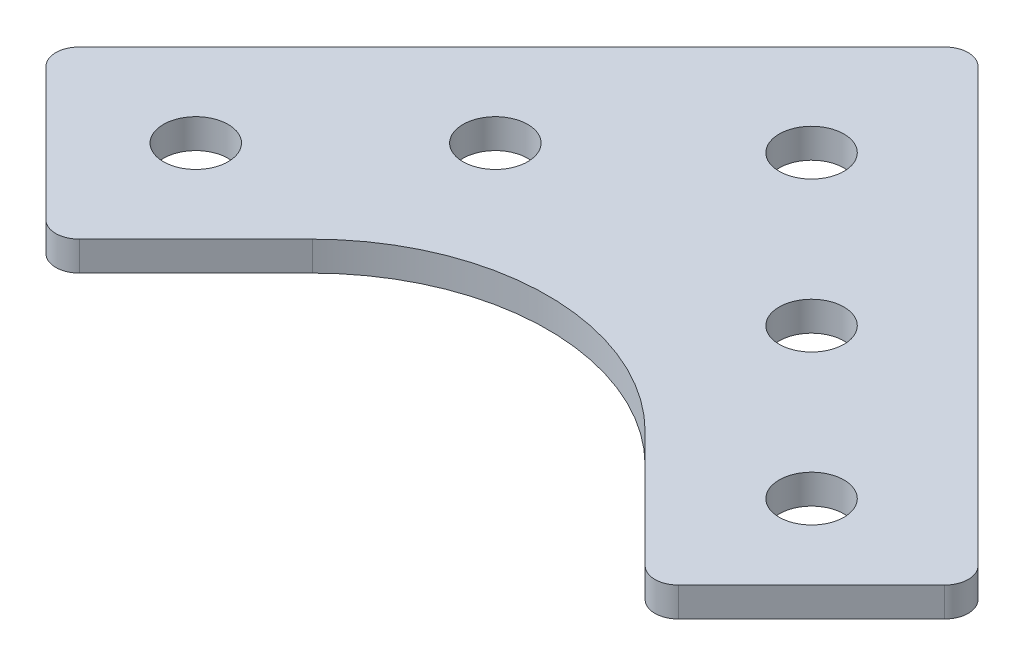
ISO-10303-21;
HEADER;
FILE_DESCRIPTION(('STEP AP214'),'2;1');
FILE_NAME('part.step','',(''),(''),'','','');
FILE_SCHEMA(('AUTOMOTIVE_DESIGN { 1 0 10303 214 1 1 1 1 }'));
ENDSEC;
DATA;
#1=APPLICATION_CONTEXT('core data for automotive mechanical design processes');
#2=APPLICATION_PROTOCOL_DEFINITION('international standard','automotive_design',2000,#1);
#3=PRODUCT_CONTEXT('',#1,'mechanical');
#4=PRODUCT('Part','Part','',(#3));
#5=PRODUCT_RELATED_PRODUCT_CATEGORY('part','',(#4));
#6=PRODUCT_DEFINITION_FORMATION('','',#4);
#7=PRODUCT_DEFINITION_CONTEXT('part definition',#1,'design');
#8=PRODUCT_DEFINITION('design','',#6,#7);
#9=PRODUCT_DEFINITION_SHAPE('','',#8);
#10=(LENGTH_UNIT() NAMED_UNIT(*) SI_UNIT(.MILLI.,.METRE.));
#11=(NAMED_UNIT(*) PLANE_ANGLE_UNIT() SI_UNIT($,.RADIAN.));
#12=(NAMED_UNIT(*) SI_UNIT($,.STERADIAN.) SOLID_ANGLE_UNIT());
#13=UNCERTAINTY_MEASURE_WITH_UNIT(LENGTH_MEASURE(1.E-05),#10,'distance_accuracy_value','');
#14=(GEOMETRIC_REPRESENTATION_CONTEXT(3) GLOBAL_UNCERTAINTY_ASSIGNED_CONTEXT((#13)) GLOBAL_UNIT_ASSIGNED_CONTEXT((#10,
#11,#12)) REPRESENTATION_CONTEXT('',''));
#15=CARTESIAN_POINT('',(0.,0.,0.));
#16=DIRECTION('',(0.,0.,1.));
#17=DIRECTION('',(1.,0.,0.));
#18=AXIS2_PLACEMENT_3D('',#15,#16,#17);
#19=CARTESIAN_POINT('',(-32.3289220358489,3.175,32.328922035849));
#20=DIRECTION('',(-0.707106781186547,0.,0.707106781186548));
#21=DIRECTION('',(0.707106781186548,0.,0.707106781186547));
#22=AXIS2_PLACEMENT_3D('',#19,#20,#21);
#23=PLANE('',#22);
#24=DIRECTION('',(-0.707106781186548,0.,-0.707106781186547));
#25=VECTOR('',#24,1.);
#26=CARTESIAN_POINT('',(-32.3289220358489,0.,32.328922035849));
#27=LINE('',#26,#25);
#28=CARTESIAN_POINT('',(-34.1249732600627,0.,30.5328708116352));
#29=VERTEX_POINT('',#28);
#30=CARTESIAN_POINT('',(-48.4933830537733,0.,16.1644610179246));
#31=VERTEX_POINT('',#30);
#32=EDGE_CURVE('E136',#29,#31,#27,.T.);
#33=ORIENTED_EDGE('',*,*,#32,.F.);
#34=DIRECTION('',(0.,-1.,0.));
#35=VECTOR('',#34,1.);
#36=CARTESIAN_POINT('',(-34.1249732600627,3.175,30.5328708116352));
#37=LINE('',#36,#35);
#38=CARTESIAN_POINT('',(-34.1249732600627,3.175,30.5328708116352));
#39=VERTEX_POINT('',#38);
#40=EDGE_CURVE('E220',#29,#39,#37,.F.);
#41=ORIENTED_EDGE('',*,*,#40,.T.);
#42=DIRECTION('',(-0.707106781186548,0.,-0.707106781186547));
#43=VECTOR('',#42,1.);
#44=CARTESIAN_POINT('',(-32.3289220358489,3.175,32.328922035849));
#45=LINE('',#44,#43);
#46=CARTESIAN_POINT('',(-48.4933830537733,3.175,16.1644610179246));
#47=VERTEX_POINT('',#46);
#48=EDGE_CURVE('E265',#39,#47,#45,.T.);
#49=ORIENTED_EDGE('',*,*,#48,.T.);
#50=DIRECTION('',(0.,-1.,0.));
#51=VECTOR('',#50,1.);
#52=CARTESIAN_POINT('',(-48.4933830537733,3.175,16.1644610179246));
#53=LINE('',#52,#51);
#54=EDGE_CURVE('E217',#47,#31,#53,.T.);
#55=ORIENTED_EDGE('',*,*,#54,.T.);
#56=EDGE_LOOP('',(#33,#41,#49,#55));
#57=FACE_BOUND('',#56,.T.);
#58=ADVANCED_FACE('F44',(#57),#23,.T.);
#59=CARTESIAN_POINT('',(0.,3.175,0.));
#60=DIRECTION('',(0.707106781186549,0.,0.707106781186546));
#61=DIRECTION('',(0.707106781186546,0.,-0.707106781186549));
#62=AXIS2_PLACEMENT_3D('',#59,#60,#61);
#63=PLANE('',#62);
#64=DIRECTION('',(-0.707106781186546,0.,0.707106781186549));
#65=VECTOR('',#64,1.);
#66=CARTESIAN_POINT('',(0.,0.,0.));
#67=LINE('',#66,#65);
#68=CARTESIAN_POINT('',(-17.9605122421384,0.,17.9605122421384));
#69=VERTEX_POINT('',#68);
#70=CARTESIAN_POINT('',(-30.5328708116351,0.,30.5328708116352));
#71=VERTEX_POINT('',#70);
#72=EDGE_CURVE('E243',#69,#71,#67,.T.);
#73=ORIENTED_EDGE('',*,*,#72,.F.);
#74=DIRECTION('',(0.,-1.,0.));
#75=VECTOR('',#74,1.);
#76=CARTESIAN_POINT('',(-17.9605122421384,3.175,17.9605122421384));
#77=LINE('',#76,#75);
#78=CARTESIAN_POINT('',(-17.9605122421384,3.175,17.9605122421384));
#79=VERTEX_POINT('',#78);
#80=EDGE_CURVE('E66',#69,#79,#77,.F.);
#81=ORIENTED_EDGE('',*,*,#80,.T.);
#82=DIRECTION('',(-0.707106781186546,0.,0.707106781186549));
#83=VECTOR('',#82,1.);
#84=CARTESIAN_POINT('',(0.,3.175,0.));
#85=LINE('',#84,#83);
#86=CARTESIAN_POINT('',(-30.5328708116351,3.175,30.5328708116352));
#87=VERTEX_POINT('',#86);
#88=EDGE_CURVE('E269',#79,#87,#85,.T.);
#89=ORIENTED_EDGE('',*,*,#88,.T.);
#90=DIRECTION('',(0.,-1.,0.));
#91=VECTOR('',#90,1.);
#92=CARTESIAN_POINT('',(-30.5328708116351,3.175,30.5328708116352));
#93=LINE('',#92,#91);
#94=EDGE_CURVE('E213',#87,#71,#93,.T.);
#95=ORIENTED_EDGE('',*,*,#94,.T.);
#96=EDGE_LOOP('',(#73,#81,#89,#95));
#97=FACE_BOUND('',#96,.T.);
#98=ADVANCED_FACE('F357',(#97),#63,.T.);
#99=CARTESIAN_POINT('',(32.3289220358488,3.175,32.3289220358491));
#100=DIRECTION('',(-0.70710678118655,0.,0.707106781186545));
#101=DIRECTION('',(0.707106781186545,0.,0.70710678118655));
#102=AXIS2_PLACEMENT_3D('',#99,#100,#101);
#103=PLANE('',#102);
#104=DIRECTION('',(-0.707106781186545,0.,-0.70710678118655));
#105=VECTOR('',#104,1.);
#106=CARTESIAN_POINT('',(32.3289220358488,3.175,32.3289220358491));
#107=LINE('',#106,#105);
#108=CARTESIAN_POINT('',(30.532870811635,3.175,30.5328708116352));
#109=VERTEX_POINT('',#108);
#110=CARTESIAN_POINT('',(17.9605122421383,3.175,17.9605122421385));
#111=VERTEX_POINT('',#110);
#112=EDGE_CURVE('E237',#109,#111,#107,.T.);
#113=ORIENTED_EDGE('',*,*,#112,.T.);
#114=DIRECTION('',(0.,-1.,0.));
#115=VECTOR('',#114,1.);
#116=CARTESIAN_POINT('',(17.9605122421383,0.,17.9605122421385));
#117=LINE('',#116,#115);
#118=CARTESIAN_POINT('',(17.9605122421383,0.,17.9605122421385));
#119=VERTEX_POINT('',#118);
#120=EDGE_CURVE('E223',#111,#119,#117,.T.);
#121=ORIENTED_EDGE('',*,*,#120,.T.);
#122=DIRECTION('',(-0.707106781186545,0.,-0.70710678118655));
#123=VECTOR('',#122,1.);
#124=CARTESIAN_POINT('',(32.3289220358488,0.,32.3289220358491));
#125=LINE('',#124,#123);
#126=CARTESIAN_POINT('',(30.532870811635,0.,30.5328708116352));
#127=VERTEX_POINT('',#126);
#128=EDGE_CURVE('E234',#127,#119,#125,.T.);
#129=ORIENTED_EDGE('',*,*,#128,.F.);
#130=DIRECTION('',(0.,-1.,0.));
#131=VECTOR('',#130,1.);
#132=CARTESIAN_POINT('',(30.532870811635,3.175,30.5328708116352));
#133=LINE('',#132,#131);
#134=EDGE_CURVE('E210',#127,#109,#133,.F.);
#135=ORIENTED_EDGE('',*,*,#134,.T.);
#136=EDGE_LOOP('',(#113,#121,#129,#135));
#137=FACE_BOUND('',#136,.T.);
#138=ADVANCED_FACE('F233',(#137),#103,.T.);
#139=CARTESIAN_POINT('',(32.3289220358488,3.175,32.3289220358491));
#140=DIRECTION('',(-0.707106781186545,0.,-0.70710678118655));
#141=DIRECTION('',(-0.70710678118655,0.,0.707106781186545));
#142=AXIS2_PLACEMENT_3D('',#139,#140,#141);
#143=PLANE('',#142);
#144=DIRECTION('',(0.70710678118655,0.,-0.707106781186545));
#145=VECTOR('',#144,1.);
#146=CARTESIAN_POINT('',(32.3289220358488,0.,32.3289220358491));
#147=LINE('',#146,#145);
#148=CARTESIAN_POINT('',(34.1249732600627,0.,30.5328708116352));
#149=VERTEX_POINT('',#148);
#150=CARTESIAN_POINT('',(48.4933830537734,0.,16.1644610179246));
#151=VERTEX_POINT('',#150);
#152=EDGE_CURVE('E242',#149,#151,#147,.T.);
#153=ORIENTED_EDGE('',*,*,#152,.T.);
#154=DIRECTION('',(0.,-1.,0.));
#155=VECTOR('',#154,1.);
#156=CARTESIAN_POINT('',(48.4933830537734,3.175,16.1644610179246));
#157=LINE('',#156,#155);
#158=CARTESIAN_POINT('',(48.4933830537734,3.175,16.1644610179246));
#159=VERTEX_POINT('',#158);
#160=EDGE_CURVE('E207',#151,#159,#157,.F.);
#161=ORIENTED_EDGE('',*,*,#160,.T.);
#162=DIRECTION('',(0.70710678118655,0.,-0.707106781186545));
#163=VECTOR('',#162,1.);
#164=CARTESIAN_POINT('',(32.3289220358488,3.175,32.3289220358491));
#165=LINE('',#164,#163);
#166=CARTESIAN_POINT('',(34.1249732600627,3.175,30.5328708116352));
#167=VERTEX_POINT('',#166);
#168=EDGE_CURVE('E166',#167,#159,#165,.T.);
#169=ORIENTED_EDGE('',*,*,#168,.F.);
#170=DIRECTION('',(0.,-1.,0.));
#171=VECTOR('',#170,1.);
#172=CARTESIAN_POINT('',(34.1249732600627,0.,30.5328708116352));
#173=LINE('',#172,#171);
#174=EDGE_CURVE('E203',#167,#149,#173,.T.);
#175=ORIENTED_EDGE('',*,*,#174,.T.);
#176=EDGE_LOOP('',(#153,#161,#169,#175));
#177=FACE_BOUND('',#176,.T.);
#178=ADVANCED_FACE('F394',(#177),#143,.F.);
#179=CARTESIAN_POINT('',(0.,3.175,-35.9210244842767));
#180=DIRECTION('',(0.707106781186549,0.,-0.707106781186546));
#181=DIRECTION('',(-0.707106781186546,0.,-0.707106781186549));
#182=AXIS2_PLACEMENT_3D('',#179,#180,#181);
#183=PLANE('',#182);
#184=DIRECTION('',(0.707106781186546,0.,0.707106781186549));
#185=VECTOR('',#184,1.);
#186=CARTESIAN_POINT('',(0.,0.,-35.9210244842767));
#187=LINE('',#186,#185);
#188=CARTESIAN_POINT('',(1.79605122421384,0.,-34.1249732600628));
#189=VERTEX_POINT('',#188);
#190=CARTESIAN_POINT('',(48.4933830537734,0.,12.572358569497));
#191=VERTEX_POINT('',#190);
#192=EDGE_CURVE('E154',#189,#191,#187,.T.);
#193=ORIENTED_EDGE('',*,*,#192,.F.);
#194=DIRECTION('',(0.,-1.,0.));
#195=VECTOR('',#194,1.);
#196=CARTESIAN_POINT('',(1.79605122421384,3.175,-34.1249732600628));
#197=LINE('',#196,#195);
#198=CARTESIAN_POINT('',(1.79605122421385,3.175,-34.1249732600628));
#199=VERTEX_POINT('',#198);
#200=EDGE_CURVE('E185',#189,#199,#197,.F.);
#201=ORIENTED_EDGE('',*,*,#200,.T.);
#202=DIRECTION('',(-0.707106781186545,0.,-0.70710678118655));
#203=VECTOR('',#202,1.);
#204=CARTESIAN_POINT('',(50.2894342779872,3.175,14.3684097937108));
#205=LINE('',#204,#203);
#206=CARTESIAN_POINT('',(48.4933830537734,3.175,12.572358569497));
#207=VERTEX_POINT('',#206);
#208=EDGE_CURVE('E160',#207,#199,#205,.T.);
#209=ORIENTED_EDGE('',*,*,#208,.F.);
#210=DIRECTION('',(0.,-1.,0.));
#211=VECTOR('',#210,1.);
#212=CARTESIAN_POINT('',(48.4933830537734,0.,12.5723585694969));
#213=LINE('',#212,#211);
#214=EDGE_CURVE('E181',#207,#191,#213,.T.);
#215=ORIENTED_EDGE('',*,*,#214,.T.);
#216=EDGE_LOOP('',(#193,#201,#209,#215));
#217=FACE_BOUND('',#216,.T.);
#218=ADVANCED_FACE('F256',(#217),#183,.T.);
#219=CARTESIAN_POINT('',(-17.9605122421382,3.175,-17.9605122421383));
#220=DIRECTION('',(-0.70710678118655,0.,-0.707106781186545));
#221=DIRECTION('',(-0.707106781186545,0.,0.70710678118655));
#222=AXIS2_PLACEMENT_3D('',#219,#220,#221);
#223=PLANE('',#222);
#224=DIRECTION('',(-0.707106781186547,0.,0.707106781186548));
#225=VECTOR('',#224,1.);
#226=CARTESIAN_POINT('',(-17.9605122421382,3.175,-17.9605122421383));
#227=LINE('',#226,#225);
#228=CARTESIAN_POINT('',(-1.79605122421378,3.175,-34.1249732600628));
#229=VERTEX_POINT('',#228);
#230=CARTESIAN_POINT('',(-48.4933830537734,3.175,12.5723585694969));
#231=VERTEX_POINT('',#230);
#232=EDGE_CURVE('E153',#229,#231,#227,.T.);
#233=ORIENTED_EDGE('',*,*,#232,.F.);
#234=DIRECTION('',(0.,-1.,0.));
#235=VECTOR('',#234,1.);
#236=CARTESIAN_POINT('',(-1.79605122421383,3.175,-34.1249732600628));
#237=LINE('',#236,#235);
#238=CARTESIAN_POINT('',(-1.79605122421383,0.,-34.1249732600628));
#239=VERTEX_POINT('',#238);
#240=EDGE_CURVE('E143',#229,#239,#237,.T.);
#241=ORIENTED_EDGE('',*,*,#240,.T.);
#242=DIRECTION('',(0.707106781186545,0.,-0.70710678118655));
#243=VECTOR('',#242,1.);
#244=CARTESIAN_POINT('',(-17.9605122421382,0.,-17.9605122421383));
#245=LINE('',#244,#243);
#246=CARTESIAN_POINT('',(-48.4933830537733,0.,12.572358569497));
#247=VERTEX_POINT('',#246);
#248=EDGE_CURVE('E134',#247,#239,#245,.T.);
#249=ORIENTED_EDGE('',*,*,#248,.F.);
#250=DIRECTION('',(0.,-1.,0.));
#251=VECTOR('',#250,1.);
#252=CARTESIAN_POINT('',(-48.4933830537733,3.175,12.572358569497));
#253=LINE('',#252,#251);
#254=EDGE_CURVE('E149',#247,#231,#253,.F.);
#255=ORIENTED_EDGE('',*,*,#254,.T.);
#256=EDGE_LOOP('',(#233,#241,#249,#255));
#257=FACE_BOUND('',#256,.T.);
#258=ADVANCED_FACE('F148',(#257),#223,.T.);
#259=CARTESIAN_POINT('',(0.,3.175,0.));
#260=DIRECTION('',(0.,-1.,0.));
#261=DIRECTION('',(0.,0.,-1.));
#262=AXIS2_PLACEMENT_3D('',#259,#260,#261);
#263=PLANE('',#262);
#264=CARTESIAN_POINT('',(17.0624866300314,3.175,-0.898025612106834));
#265=DIRECTION('',(0.,1.,0.));
#266=DIRECTION('',(0.,0.,1.));
#267=AXIS2_PLACEMENT_3D('',#264,#265,#266);
#268=CIRCLE('',#267,3.49250000000001);
#269=CARTESIAN_POINT('',(17.0624866300314,3.175,2.59447438789317));
#270=VERTEX_POINT('',#269);
#271=EDGE_CURVE('E315',#270,#270,#268,.T.);
#272=ORIENTED_EDGE('',*,*,#271,.F.);
#273=EDGE_LOOP('',(#272));
#274=FACE_BOUND('',#273,.T.);
#275=CARTESIAN_POINT('',(0.898025612106959,3.175,-17.0624866300314));
#276=DIRECTION('',(0.,1.,0.));
#277=DIRECTION('',(0.,0.,1.));
#278=AXIS2_PLACEMENT_3D('',#275,#276,#277);
#279=CIRCLE('',#278,3.49250000000001);
#280=CARTESIAN_POINT('',(0.898025612106959,3.175,-13.5699866300313));
#281=VERTEX_POINT('',#280);
#282=EDGE_CURVE('E307',#281,#281,#279,.T.);
#283=ORIENTED_EDGE('',*,*,#282,.F.);
#284=EDGE_LOOP('',(#283));
#285=FACE_BOUND('',#284,.T.);
#286=CARTESIAN_POINT('',(33.2269476479558,3.175,15.2664354058177));
#287=DIRECTION('',(0.,1.,0.));
#288=DIRECTION('',(0.,0.,1.));
#289=AXIS2_PLACEMENT_3D('',#286,#287,#288);
#290=CIRCLE('',#289,3.49250000000001);
#291=CARTESIAN_POINT('',(33.2269476479558,3.175,18.7589354058177));
#292=VERTEX_POINT('',#291);
#293=EDGE_CURVE('E299',#292,#292,#290,.T.);
#294=ORIENTED_EDGE('',*,*,#293,.F.);
#295=EDGE_LOOP('',(#294));
#296=FACE_BOUND('',#295,.T.);
#297=CARTESIAN_POINT('',(-17.0624866300314,3.175,-0.898025612106886));
#298=DIRECTION('',(0.,1.,0.));
#299=DIRECTION('',(0.,0.,1.));
#300=AXIS2_PLACEMENT_3D('',#297,#298,#299);
#301=CIRCLE('',#300,3.49250000000001);
#302=CARTESIAN_POINT('',(-17.0624866300314,3.175,2.59447438789312));
#303=VERTEX_POINT('',#302);
#304=EDGE_CURVE('E291',#303,#303,#301,.T.);
#305=ORIENTED_EDGE('',*,*,#304,.F.);
#306=EDGE_LOOP('',(#305));
#307=FACE_BOUND('',#306,.T.);
#308=CARTESIAN_POINT('',(-33.2269476479558,3.175,15.2664354058176));
#309=DIRECTION('',(0.,1.,0.));
#310=DIRECTION('',(0.,0.,1.));
#311=AXIS2_PLACEMENT_3D('',#308,#309,#310);
#312=CIRCLE('',#311,3.49250000000001);
#313=CARTESIAN_POINT('',(-33.2269476479558,3.175,18.7589354058176));
#314=VERTEX_POINT('',#313);
#315=EDGE_CURVE('E272',#314,#314,#312,.T.);
#316=ORIENTED_EDGE('',*,*,#315,.F.);
#317=EDGE_LOOP('',(#316));
#318=FACE_BOUND('',#317,.T.);
#319=ORIENTED_EDGE('',*,*,#208,.T.);
#320=CARTESIAN_POINT('',(0.,3.175,-32.328922035849));
#321=DIRECTION('',(0.,-1.,0.));
#322=DIRECTION('',(0.,0.,-1.));
#323=AXIS2_PLACEMENT_3D('',#320,#321,#322);
#324=CIRCLE('',#323,2.54);
#325=EDGE_CURVE('E200',#199,#229,#324,.F.);
#326=ORIENTED_EDGE('',*,*,#325,.T.);
#327=ORIENTED_EDGE('',*,*,#232,.T.);
#328=CARTESIAN_POINT('',(-46.6973318295594,3.175,14.3684097937108));
#329=DIRECTION('',(0.,-1.,0.));
#330=DIRECTION('',(0.,0.,-1.));
#331=AXIS2_PLACEMENT_3D('',#328,#329,#330);
#332=CIRCLE('',#331,2.54);
#333=EDGE_CURVE('E158',#231,#47,#332,.F.);
#334=ORIENTED_EDGE('',*,*,#333,.T.);
#335=ORIENTED_EDGE('',*,*,#48,.F.);
#336=CARTESIAN_POINT('',(-32.3289220358489,3.175,28.7368195874213));
#337=DIRECTION('',(0.,-1.,0.));
#338=DIRECTION('',(0.,0.,-1.));
#339=AXIS2_PLACEMENT_3D('',#336,#337,#338);
#340=CIRCLE('',#339,2.54);
#341=EDGE_CURVE('E190',#39,#87,#340,.F.);
#342=ORIENTED_EDGE('',*,*,#341,.T.);
#343=ORIENTED_EDGE('',*,*,#88,.F.);
#344=CARTESIAN_POINT('',(0.,3.175,35.9210244842767));
#345=DIRECTION('',(0.,-1.,0.));
#346=DIRECTION('',(0.,0.,-1.));
#347=AXIS2_PLACEMENT_3D('',#344,#345,#346);
#348=CIRCLE('',#347,25.4);
#349=EDGE_CURVE('E11',#79,#111,#348,.T.);
#350=ORIENTED_EDGE('',*,*,#349,.T.);
#351=ORIENTED_EDGE('',*,*,#112,.F.);
#352=CARTESIAN_POINT('',(32.3289220358488,3.175,28.7368195874214));
#353=DIRECTION('',(0.,-1.,0.));
#354=DIRECTION('',(0.,0.,-1.));
#355=AXIS2_PLACEMENT_3D('',#352,#353,#354);
#356=CIRCLE('',#355,2.54);
#357=EDGE_CURVE('E194',#109,#167,#356,.F.);
#358=ORIENTED_EDGE('',*,*,#357,.T.);
#359=ORIENTED_EDGE('',*,*,#168,.T.);
#360=CARTESIAN_POINT('',(46.6973318295596,3.175,14.3684097937108));
#361=DIRECTION('',(0.,-1.,0.));
#362=DIRECTION('',(0.,0.,-1.));
#363=AXIS2_PLACEMENT_3D('',#360,#361,#362);
#364=CIRCLE('',#363,2.54);
#365=EDGE_CURVE('E197',#159,#207,#364,.F.);
#366=ORIENTED_EDGE('',*,*,#365,.T.);
#367=EDGE_LOOP('',(#319,#326,#327,#334,#335,#342,#343,#350,#351,#358,#359,#366));
#368=FACE_BOUND('',#367,.T.);
#369=ADVANCED_FACE('F263',(#274,#285,#296,#307,#318,#368),#263,.F.);
#370=CARTESIAN_POINT('',(0.,0.,0.));
#371=DIRECTION('',(0.,-1.,0.));
#372=DIRECTION('',(0.,0.,-1.));
#373=AXIS2_PLACEMENT_3D('',#370,#371,#372);
#374=PLANE('',#373);
#375=CARTESIAN_POINT('',(17.0624866300314,0.,-0.898025612106834));
#376=DIRECTION('',(0.,1.,0.));
#377=DIRECTION('',(0.,0.,1.));
#378=AXIS2_PLACEMENT_3D('',#375,#376,#377);
#379=CIRCLE('',#378,3.49250000000001);
#380=CARTESIAN_POINT('',(17.0624866300314,0.,2.59447438789317));
#381=VERTEX_POINT('',#380);
#382=EDGE_CURVE('E303',#381,#381,#379,.T.);
#383=ORIENTED_EDGE('',*,*,#382,.T.);
#384=EDGE_LOOP('',(#383));
#385=FACE_BOUND('',#384,.T.);
#386=CARTESIAN_POINT('',(0.898025612106959,0.,-17.0624866300314));
#387=DIRECTION('',(0.,1.,0.));
#388=DIRECTION('',(0.,0.,1.));
#389=AXIS2_PLACEMENT_3D('',#386,#387,#388);
#390=CIRCLE('',#389,3.49250000000001);
#391=CARTESIAN_POINT('',(0.898025612106959,0.,-13.5699866300313));
#392=VERTEX_POINT('',#391);
#393=EDGE_CURVE('E311',#392,#392,#390,.T.);
#394=ORIENTED_EDGE('',*,*,#393,.T.);
#395=EDGE_LOOP('',(#394));
#396=FACE_BOUND('',#395,.T.);
#397=CARTESIAN_POINT('',(33.2269476479558,0.,15.2664354058177));
#398=DIRECTION('',(0.,1.,0.));
#399=DIRECTION('',(0.,0.,1.));
#400=AXIS2_PLACEMENT_3D('',#397,#398,#399);
#401=CIRCLE('',#400,3.49250000000001);
#402=CARTESIAN_POINT('',(33.2269476479558,0.,18.7589354058177));
#403=VERTEX_POINT('',#402);
#404=EDGE_CURVE('E295',#403,#403,#401,.T.);
#405=ORIENTED_EDGE('',*,*,#404,.T.);
#406=EDGE_LOOP('',(#405));
#407=FACE_BOUND('',#406,.T.);
#408=CARTESIAN_POINT('',(-17.0624866300314,0.,-0.898025612106886));
#409=DIRECTION('',(0.,1.,0.));
#410=DIRECTION('',(0.,0.,1.));
#411=AXIS2_PLACEMENT_3D('',#408,#409,#410);
#412=CIRCLE('',#411,3.49250000000001);
#413=CARTESIAN_POINT('',(-17.0624866300314,0.,2.59447438789312));
#414=VERTEX_POINT('',#413);
#415=EDGE_CURVE('E289',#414,#414,#412,.T.);
#416=ORIENTED_EDGE('',*,*,#415,.T.);
#417=EDGE_LOOP('',(#416));
#418=FACE_BOUND('',#417,.T.);
#419=CARTESIAN_POINT('',(-33.2269476479558,0.,15.2664354058176));
#420=DIRECTION('',(0.,1.,0.));
#421=DIRECTION('',(0.,0.,1.));
#422=AXIS2_PLACEMENT_3D('',#419,#420,#421);
#423=CIRCLE('',#422,3.49250000000001);
#424=CARTESIAN_POINT('',(-33.2269476479558,0.,18.7589354058176));
#425=VERTEX_POINT('',#424);
#426=EDGE_CURVE('E282',#425,#425,#423,.T.);
#427=ORIENTED_EDGE('',*,*,#426,.T.);
#428=EDGE_LOOP('',(#427));
#429=FACE_BOUND('',#428,.T.);
#430=ORIENTED_EDGE('',*,*,#248,.T.);
#431=CARTESIAN_POINT('',(0.,0.,-32.328922035849));
#432=DIRECTION('',(0.,-1.,0.));
#433=DIRECTION('',(0.,0.,-1.));
#434=AXIS2_PLACEMENT_3D('',#431,#432,#433);
#435=CIRCLE('',#434,2.54);
#436=EDGE_CURVE('E178',#239,#189,#435,.T.);
#437=ORIENTED_EDGE('',*,*,#436,.T.);
#438=ORIENTED_EDGE('',*,*,#192,.T.);
#439=CARTESIAN_POINT('',(46.6973318295596,0.,14.3684097937108));
#440=DIRECTION('',(0.,-1.,0.));
#441=DIRECTION('',(0.,0.,-1.));
#442=AXIS2_PLACEMENT_3D('',#439,#440,#441);
#443=CIRCLE('',#442,2.54);
#444=EDGE_CURVE('E175',#191,#151,#443,.T.);
#445=ORIENTED_EDGE('',*,*,#444,.T.);
#446=ORIENTED_EDGE('',*,*,#152,.F.);
#447=CARTESIAN_POINT('',(32.3289220358488,0.,28.7368195874214));
#448=DIRECTION('',(0.,-1.,0.));
#449=DIRECTION('',(0.,0.,-1.));
#450=AXIS2_PLACEMENT_3D('',#447,#448,#449);
#451=CIRCLE('',#450,2.54);
#452=EDGE_CURVE('E172',#149,#127,#451,.T.);
#453=ORIENTED_EDGE('',*,*,#452,.T.);
#454=ORIENTED_EDGE('',*,*,#128,.T.);
#455=CARTESIAN_POINT('',(0.,0.,35.9210244842767));
#456=DIRECTION('',(0.,-1.,0.));
#457=DIRECTION('',(0.,0.,-1.));
#458=AXIS2_PLACEMENT_3D('',#455,#456,#457);
#459=CIRCLE('',#458,25.4);
#460=EDGE_CURVE('E53',#119,#69,#459,.F.);
#461=ORIENTED_EDGE('',*,*,#460,.T.);
#462=ORIENTED_EDGE('',*,*,#72,.T.);
#463=CARTESIAN_POINT('',(-32.3289220358489,0.,28.7368195874213));
#464=DIRECTION('',(0.,-1.,0.));
#465=DIRECTION('',(0.,0.,-1.));
#466=AXIS2_PLACEMENT_3D('',#463,#464,#465);
#467=CIRCLE('',#466,2.54);
#468=EDGE_CURVE('E142',#71,#29,#467,.T.);
#469=ORIENTED_EDGE('',*,*,#468,.T.);
#470=ORIENTED_EDGE('',*,*,#32,.T.);
#471=CARTESIAN_POINT('',(-46.6973318295594,0.,14.3684097937108));
#472=DIRECTION('',(0.,-1.,0.));
#473=DIRECTION('',(0.,0.,-1.));
#474=AXIS2_PLACEMENT_3D('',#471,#472,#473);
#475=CIRCLE('',#474,2.54);
#476=EDGE_CURVE('E131',#31,#247,#475,.T.);
#477=ORIENTED_EDGE('',*,*,#476,.T.);
#478=EDGE_LOOP('',(#430,#437,#438,#445,#446,#453,#454,#461,#462,#469,#470,#477));
#479=FACE_BOUND('',#478,.T.);
#480=ADVANCED_FACE('F133',(#385,#396,#407,#418,#429,#479),#374,.T.);
#481=CARTESIAN_POINT('',(-33.2269476479558,0.,15.2664354058176));
#482=DIRECTION('',(0.,1.,0.));
#483=DIRECTION('',(0.,0.,1.));
#484=AXIS2_PLACEMENT_3D('',#481,#482,#483);
#485=CYLINDRICAL_SURFACE('',#484,3.49250000000001);
#486=ORIENTED_EDGE('',*,*,#426,.F.);
#487=EDGE_LOOP('',(#486));
#488=FACE_BOUND('',#487,.T.);
#489=ORIENTED_EDGE('',*,*,#315,.T.);
#490=EDGE_LOOP('',(#489));
#491=FACE_BOUND('',#490,.T.);
#492=ADVANCED_FACE('F343',(#488,#491),#485,.F.);
#493=CARTESIAN_POINT('',(-17.0624866300314,0.,-0.898025612106886));
#494=DIRECTION('',(0.,1.,0.));
#495=DIRECTION('',(0.,0.,1.));
#496=AXIS2_PLACEMENT_3D('',#493,#494,#495);
#497=CYLINDRICAL_SURFACE('',#496,3.49250000000001);
#498=ORIENTED_EDGE('',*,*,#415,.F.);
#499=EDGE_LOOP('',(#498));
#500=FACE_BOUND('',#499,.T.);
#501=ORIENTED_EDGE('',*,*,#304,.T.);
#502=EDGE_LOOP('',(#501));
#503=FACE_BOUND('',#502,.T.);
#504=ADVANCED_FACE('F345',(#500,#503),#497,.F.);
#505=CARTESIAN_POINT('',(33.2269476479558,0.,15.2664354058177));
#506=DIRECTION('',(0.,1.,0.));
#507=DIRECTION('',(0.,0.,1.));
#508=AXIS2_PLACEMENT_3D('',#505,#506,#507);
#509=CYLINDRICAL_SURFACE('',#508,3.49250000000001);
#510=ORIENTED_EDGE('',*,*,#404,.F.);
#511=EDGE_LOOP('',(#510));
#512=FACE_BOUND('',#511,.T.);
#513=ORIENTED_EDGE('',*,*,#293,.T.);
#514=EDGE_LOOP('',(#513));
#515=FACE_BOUND('',#514,.T.);
#516=ADVANCED_FACE('F352',(#512,#515),#509,.F.);
#517=CARTESIAN_POINT('',(0.898025612106959,0.,-17.0624866300314));
#518=DIRECTION('',(0.,1.,0.));
#519=DIRECTION('',(0.,0.,1.));
#520=AXIS2_PLACEMENT_3D('',#517,#518,#519);
#521=CYLINDRICAL_SURFACE('',#520,3.49250000000001);
#522=ORIENTED_EDGE('',*,*,#393,.F.);
#523=EDGE_LOOP('',(#522));
#524=FACE_BOUND('',#523,.T.);
#525=ORIENTED_EDGE('',*,*,#282,.T.);
#526=EDGE_LOOP('',(#525));
#527=FACE_BOUND('',#526,.T.);
#528=ADVANCED_FACE('F328',(#524,#527),#521,.F.);
#529=CARTESIAN_POINT('',(17.0624866300314,0.,-0.898025612106834));
#530=DIRECTION('',(0.,1.,0.));
#531=DIRECTION('',(0.,0.,1.));
#532=AXIS2_PLACEMENT_3D('',#529,#530,#531);
#533=CYLINDRICAL_SURFACE('',#532,3.49250000000001);
#534=ORIENTED_EDGE('',*,*,#382,.F.);
#535=EDGE_LOOP('',(#534));
#536=FACE_BOUND('',#535,.T.);
#537=ORIENTED_EDGE('',*,*,#271,.T.);
#538=EDGE_LOOP('',(#537));
#539=FACE_BOUND('',#538,.T.);
#540=ADVANCED_FACE('F325',(#536,#539),#533,.F.);
#541=CARTESIAN_POINT('',(0.,3.175,-32.328922035849));
#542=DIRECTION('',(0.,-1.,0.));
#543=DIRECTION('',(0.,0.,-1.));
#544=AXIS2_PLACEMENT_3D('',#541,#542,#543);
#545=CYLINDRICAL_SURFACE('',#544,2.54);
#546=ORIENTED_EDGE('',*,*,#325,.F.);
#547=ORIENTED_EDGE('',*,*,#200,.F.);
#548=ORIENTED_EDGE('',*,*,#436,.F.);
#549=ORIENTED_EDGE('',*,*,#240,.F.);
#550=EDGE_LOOP('',(#546,#547,#548,#549));
#551=FACE_BOUND('',#550,.T.);
#552=ADVANCED_FACE('F261',(#551),#545,.T.);
#553=CARTESIAN_POINT('',(46.6973318295596,3.175,14.3684097937108));
#554=DIRECTION('',(0.,1.,0.));
#555=DIRECTION('',(0.,0.,1.));
#556=AXIS2_PLACEMENT_3D('',#553,#554,#555);
#557=CYLINDRICAL_SURFACE('',#556,2.54);
#558=ORIENTED_EDGE('',*,*,#365,.F.);
#559=ORIENTED_EDGE('',*,*,#160,.F.);
#560=ORIENTED_EDGE('',*,*,#444,.F.);
#561=ORIENTED_EDGE('',*,*,#214,.F.);
#562=EDGE_LOOP('',(#558,#559,#560,#561));
#563=FACE_BOUND('',#562,.T.);
#564=ADVANCED_FACE('F368',(#563),#557,.T.);
#565=CARTESIAN_POINT('',(32.3289220358488,3.175,28.7368195874214));
#566=DIRECTION('',(0.,1.,0.));
#567=DIRECTION('',(0.,0.,1.));
#568=AXIS2_PLACEMENT_3D('',#565,#566,#567);
#569=CYLINDRICAL_SURFACE('',#568,2.54);
#570=ORIENTED_EDGE('',*,*,#357,.F.);
#571=ORIENTED_EDGE('',*,*,#134,.F.);
#572=ORIENTED_EDGE('',*,*,#452,.F.);
#573=ORIENTED_EDGE('',*,*,#174,.F.);
#574=EDGE_LOOP('',(#570,#571,#572,#573));
#575=FACE_BOUND('',#574,.T.);
#576=ADVANCED_FACE('F371',(#575),#569,.T.);
#577=CARTESIAN_POINT('',(-32.3289220358489,3.175,28.7368195874213));
#578=DIRECTION('',(0.,-1.,0.));
#579=DIRECTION('',(0.,0.,-1.));
#580=AXIS2_PLACEMENT_3D('',#577,#578,#579);
#581=CYLINDRICAL_SURFACE('',#580,2.54);
#582=ORIENTED_EDGE('',*,*,#341,.F.);
#583=ORIENTED_EDGE('',*,*,#40,.F.);
#584=ORIENTED_EDGE('',*,*,#468,.F.);
#585=ORIENTED_EDGE('',*,*,#94,.F.);
#586=EDGE_LOOP('',(#582,#583,#584,#585));
#587=FACE_BOUND('',#586,.T.);
#588=ADVANCED_FACE('F375',(#587),#581,.T.);
#589=CARTESIAN_POINT('',(-46.6973318295594,3.175,14.3684097937108));
#590=DIRECTION('',(0.,-1.,0.));
#591=DIRECTION('',(0.,0.,-1.));
#592=AXIS2_PLACEMENT_3D('',#589,#590,#591);
#593=CYLINDRICAL_SURFACE('',#592,2.54);
#594=ORIENTED_EDGE('',*,*,#333,.F.);
#595=ORIENTED_EDGE('',*,*,#254,.F.);
#596=ORIENTED_EDGE('',*,*,#476,.F.);
#597=ORIENTED_EDGE('',*,*,#54,.F.);
#598=EDGE_LOOP('',(#594,#595,#596,#597));
#599=FACE_BOUND('',#598,.T.);
#600=ADVANCED_FACE('F157',(#599),#593,.T.);
#601=CARTESIAN_POINT('',(0.,3.175,35.9210244842767));
#602=DIRECTION('',(0.,1.,0.));
#603=DIRECTION('',(0.,0.,1.));
#604=AXIS2_PLACEMENT_3D('',#601,#602,#603);
#605=CYLINDRICAL_SURFACE('',#604,25.4);
#606=ORIENTED_EDGE('',*,*,#349,.F.);
#607=ORIENTED_EDGE('',*,*,#80,.F.);
#608=ORIENTED_EDGE('',*,*,#460,.F.);
#609=ORIENTED_EDGE('',*,*,#120,.F.);
#610=EDGE_LOOP('',(#606,#607,#608,#609));
#611=FACE_BOUND('',#610,.T.);
#612=ADVANCED_FACE('F46',(#611),#605,.F.);
#613=CLOSED_SHELL('',(#58,#98,#138,#178,#218,#258,#369,#480,#492,#504,#516,#528,#540,#552,#564,
#576,#588,#600,#612));
#614=MANIFOLD_SOLID_BREP('B2',#613);
#615=ADVANCED_BREP_SHAPE_REPRESENTATION('',(#18,#614),#14);
#616=SHAPE_DEFINITION_REPRESENTATION(#9,#615);
ENDSEC;
END-ISO-10303-21;
